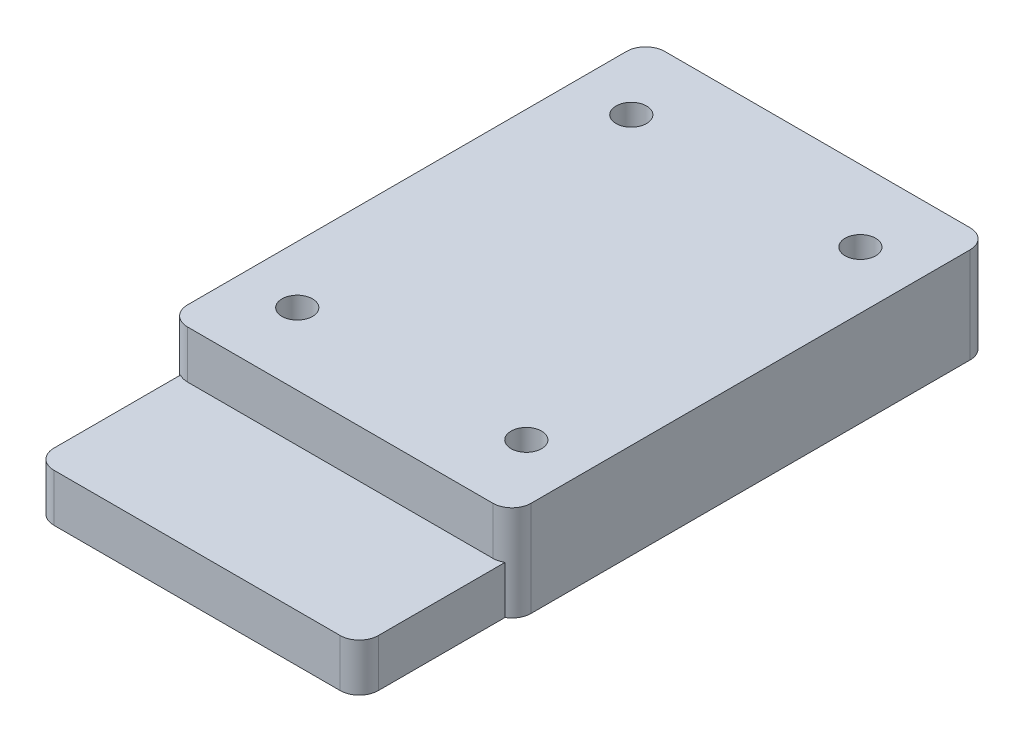
ISO-10303-21;
HEADER;
FILE_DESCRIPTION(('STEP AP214'),'2;1');
FILE_NAME('part.step','',(''),(''),'','','');
FILE_SCHEMA(('AUTOMOTIVE_DESIGN { 1 0 10303 214 1 1 1 1 }'));
ENDSEC;
DATA;
#1=APPLICATION_CONTEXT('core data for automotive mechanical design processes');
#2=APPLICATION_PROTOCOL_DEFINITION('international standard','automotive_design',2000,#1);
#3=PRODUCT_CONTEXT('',#1,'mechanical');
#4=PRODUCT('Part','Part','',(#3));
#5=PRODUCT_RELATED_PRODUCT_CATEGORY('part','',(#4));
#6=PRODUCT_DEFINITION_FORMATION('','',#4);
#7=PRODUCT_DEFINITION_CONTEXT('part definition',#1,'design');
#8=PRODUCT_DEFINITION('design','',#6,#7);
#9=PRODUCT_DEFINITION_SHAPE('','',#8);
#10=(LENGTH_UNIT() NAMED_UNIT(*) SI_UNIT(.MILLI.,.METRE.));
#11=(NAMED_UNIT(*) PLANE_ANGLE_UNIT() SI_UNIT($,.RADIAN.));
#12=(NAMED_UNIT(*) SI_UNIT($,.STERADIAN.) SOLID_ANGLE_UNIT());
#13=UNCERTAINTY_MEASURE_WITH_UNIT(LENGTH_MEASURE(1.E-05),#10,'distance_accuracy_value','');
#14=(GEOMETRIC_REPRESENTATION_CONTEXT(3) GLOBAL_UNCERTAINTY_ASSIGNED_CONTEXT((#13)) GLOBAL_UNIT_ASSIGNED_CONTEXT((#10,
#11,#12)) REPRESENTATION_CONTEXT('',''));
#15=CARTESIAN_POINT('',(0.,0.,0.));
#16=DIRECTION('',(0.,0.,1.));
#17=DIRECTION('',(1.,0.,0.));
#18=AXIS2_PLACEMENT_3D('',#15,#16,#17);
#19=CARTESIAN_POINT('',(-17.,10.,0.));
#20=DIRECTION('',(-1.,0.,0.));
#21=DIRECTION('',(0.,0.,1.));
#22=AXIS2_PLACEMENT_3D('',#19,#20,#21);
#23=PLANE('',#22);
#24=DIRECTION('',(0.,0.,-1.));
#25=VECTOR('',#24,1.);
#26=CARTESIAN_POINT('',(-17.,0.,0.));
#27=LINE('',#26,#25);
#28=CARTESIAN_POINT('',(-17.,0.,38.));
#29=VERTEX_POINT('',#28);
#30=CARTESIAN_POINT('',(-17.,0.,24.7320508075689));
#31=VERTEX_POINT('',#30);
#32=EDGE_CURVE('E284',#29,#31,#27,.T.);
#33=ORIENTED_EDGE('',*,*,#32,.F.);
#34=DIRECTION('',(0.,-1.,0.));
#35=VECTOR('',#34,1.);
#36=CARTESIAN_POINT('',(-17.,5.,38.));
#37=LINE('',#36,#35);
#38=CARTESIAN_POINT('',(-17.,5.,38.));
#39=VERTEX_POINT('',#38);
#40=EDGE_CURVE('E220',#29,#39,#37,.F.);
#41=ORIENTED_EDGE('',*,*,#40,.T.);
#42=DIRECTION('',(0.,0.,1.));
#43=VECTOR('',#42,1.);
#44=CARTESIAN_POINT('',(-17.,5.,25.));
#45=LINE('',#44,#43);
#46=CARTESIAN_POINT('',(-17.,5.,24.7320508075689));
#47=VERTEX_POINT('',#46);
#48=EDGE_CURVE('E63',#47,#39,#45,.T.);
#49=ORIENTED_EDGE('',*,*,#48,.F.);
#50=DIRECTION('',(0.,-1.,0.));
#51=VECTOR('',#50,1.);
#52=CARTESIAN_POINT('',(-17.,5.,24.7320508075689));
#53=LINE('',#52,#51);
#54=EDGE_CURVE('E224',#47,#31,#53,.T.);
#55=ORIENTED_EDGE('',*,*,#54,.T.);
#56=EDGE_LOOP('',(#33,#41,#49,#55));
#57=FACE_BOUND('',#56,.T.);
#58=ADVANCED_FACE('F41',(#57),#23,.T.);
#59=CARTESIAN_POINT('',(0.,10.,40.));
#60=DIRECTION('',(0.,0.,-1.));
#61=DIRECTION('',(-1.,0.,0.));
#62=AXIS2_PLACEMENT_3D('',#59,#60,#61);
#63=PLANE('',#62);
#64=DIRECTION('',(1.,0.,0.));
#65=VECTOR('',#64,1.);
#66=CARTESIAN_POINT('',(0.,0.,40.));
#67=LINE('',#66,#65);
#68=CARTESIAN_POINT('',(-15.,0.,40.));
#69=VERTEX_POINT('',#68);
#70=CARTESIAN_POINT('',(15.,0.,40.));
#71=VERTEX_POINT('',#70);
#72=EDGE_CURVE('E285',#69,#71,#67,.T.);
#73=ORIENTED_EDGE('',*,*,#72,.T.);
#74=DIRECTION('',(0.,-1.,0.));
#75=VECTOR('',#74,1.);
#76=CARTESIAN_POINT('',(15.,10.,40.));
#77=LINE('',#76,#75);
#78=CARTESIAN_POINT('',(15.,5.,40.));
#79=VERTEX_POINT('',#78);
#80=EDGE_CURVE('E214',#71,#79,#77,.F.);
#81=ORIENTED_EDGE('',*,*,#80,.T.);
#82=DIRECTION('',(1.,0.,0.));
#83=VECTOR('',#82,1.);
#84=CARTESIAN_POINT('',(-17.,5.,40.));
#85=LINE('',#84,#83);
#86=CARTESIAN_POINT('',(-15.,5.,40.));
#87=VERTEX_POINT('',#86);
#88=EDGE_CURVE('E245',#87,#79,#85,.T.);
#89=ORIENTED_EDGE('',*,*,#88,.F.);
#90=DIRECTION('',(0.,-1.,0.));
#91=VECTOR('',#90,1.);
#92=CARTESIAN_POINT('',(-15.,0.,40.));
#93=LINE('',#92,#91);
#94=EDGE_CURVE('E211',#87,#69,#93,.T.);
#95=ORIENTED_EDGE('',*,*,#94,.T.);
#96=EDGE_LOOP('',(#73,#81,#89,#95));
#97=FACE_BOUND('',#96,.T.);
#98=ADVANCED_FACE('F290',(#97),#63,.F.);
#99=CARTESIAN_POINT('',(17.,10.,0.));
#100=DIRECTION('',(-1.,0.,0.));
#101=DIRECTION('',(0.,0.,1.));
#102=AXIS2_PLACEMENT_3D('',#99,#100,#101);
#103=PLANE('',#102);
#104=DIRECTION('',(0.,0.,-1.));
#105=VECTOR('',#104,1.);
#106=CARTESIAN_POINT('',(17.,5.,25.));
#107=LINE('',#106,#105);
#108=CARTESIAN_POINT('',(17.,5.,38.));
#109=VERTEX_POINT('',#108);
#110=CARTESIAN_POINT('',(17.,5.,24.7320508075689));
#111=VERTEX_POINT('',#110);
#112=EDGE_CURVE('E55',#109,#111,#107,.T.);
#113=ORIENTED_EDGE('',*,*,#112,.F.);
#114=DIRECTION('',(0.,-1.,0.));
#115=VECTOR('',#114,1.);
#116=CARTESIAN_POINT('',(17.,10.,38.));
#117=LINE('',#116,#115);
#118=CARTESIAN_POINT('',(17.,0.,38.));
#119=VERTEX_POINT('',#118);
#120=EDGE_CURVE('E208',#109,#119,#117,.T.);
#121=ORIENTED_EDGE('',*,*,#120,.T.);
#122=DIRECTION('',(0.,0.,-1.));
#123=VECTOR('',#122,1.);
#124=CARTESIAN_POINT('',(17.,0.,0.));
#125=LINE('',#124,#123);
#126=CARTESIAN_POINT('',(17.,0.,24.7320508075689));
#127=VERTEX_POINT('',#126);
#128=EDGE_CURVE('E176',#119,#127,#125,.T.);
#129=ORIENTED_EDGE('',*,*,#128,.T.);
#130=DIRECTION('',(0.,1.,0.));
#131=VECTOR('',#130,1.);
#132=CARTESIAN_POINT('',(17.,0.,24.7320508075689));
#133=LINE('',#132,#131);
#134=EDGE_CURVE('E49',#127,#111,#133,.T.);
#135=ORIENTED_EDGE('',*,*,#134,.T.);
#136=EDGE_LOOP('',(#113,#121,#129,#135));
#137=FACE_BOUND('',#136,.T.);
#138=ADVANCED_FACE('F228',(#137),#103,.F.);
#139=CARTESIAN_POINT('',(18.,10.,0.));
#140=DIRECTION('',(1.,0.,0.));
#141=DIRECTION('',(0.,0.,-1.));
#142=AXIS2_PLACEMENT_3D('',#139,#140,#141);
#143=PLANE('',#142);
#144=DIRECTION('',(0.,0.,1.));
#145=VECTOR('',#144,1.);
#146=CARTESIAN_POINT('',(18.,0.,0.));
#147=LINE('',#146,#145);
#148=CARTESIAN_POINT('',(18.,0.,-23.));
#149=VERTEX_POINT('',#148);
#150=CARTESIAN_POINT('',(18.,0.,23.));
#151=VERTEX_POINT('',#150);
#152=EDGE_CURVE('E163',#149,#151,#147,.T.);
#153=ORIENTED_EDGE('',*,*,#152,.F.);
#154=DIRECTION('',(0.,-1.,0.));
#155=VECTOR('',#154,1.);
#156=CARTESIAN_POINT('',(18.,10.,-23.));
#157=LINE('',#156,#155);
#158=CARTESIAN_POINT('',(18.,10.,-23.));
#159=VERTEX_POINT('',#158);
#160=EDGE_CURVE('E190',#149,#159,#157,.F.);
#161=ORIENTED_EDGE('',*,*,#160,.T.);
#162=DIRECTION('',(0.,0.,1.));
#163=VECTOR('',#162,1.);
#164=CARTESIAN_POINT('',(18.,10.,0.));
#165=LINE('',#164,#163);
#166=CARTESIAN_POINT('',(18.,10.,23.));
#167=VERTEX_POINT('',#166);
#168=EDGE_CURVE('E274',#159,#167,#165,.T.);
#169=ORIENTED_EDGE('',*,*,#168,.T.);
#170=DIRECTION('',(0.,-1.,0.));
#171=VECTOR('',#170,1.);
#172=CARTESIAN_POINT('',(18.,0.,23.));
#173=LINE('',#172,#171);
#174=EDGE_CURVE('E187',#167,#151,#173,.T.);
#175=ORIENTED_EDGE('',*,*,#174,.T.);
#176=EDGE_LOOP('',(#153,#161,#169,#175));
#177=FACE_BOUND('',#176,.T.);
#178=ADVANCED_FACE('F319',(#177),#143,.T.);
#179=CARTESIAN_POINT('',(0.,10.,-25.));
#180=DIRECTION('',(0.,0.,-1.));
#181=DIRECTION('',(-1.,0.,0.));
#182=AXIS2_PLACEMENT_3D('',#179,#180,#181);
#183=PLANE('',#182);
#184=DIRECTION('',(1.,0.,0.));
#185=VECTOR('',#184,1.);
#186=CARTESIAN_POINT('',(0.,10.,-25.));
#187=LINE('',#186,#185);
#188=CARTESIAN_POINT('',(-16.,10.,-25.));
#189=VERTEX_POINT('',#188);
#190=CARTESIAN_POINT('',(16.,10.,-25.));
#191=VERTEX_POINT('',#190);
#192=EDGE_CURVE('E277',#189,#191,#187,.T.);
#193=ORIENTED_EDGE('',*,*,#192,.T.);
#194=DIRECTION('',(0.,-1.,0.));
#195=VECTOR('',#194,1.);
#196=CARTESIAN_POINT('',(16.,10.,-25.));
#197=LINE('',#196,#195);
#198=CARTESIAN_POINT('',(16.,0.,-25.));
#199=VERTEX_POINT('',#198);
#200=EDGE_CURVE('E162',#191,#199,#197,.T.);
#201=ORIENTED_EDGE('',*,*,#200,.T.);
#202=DIRECTION('',(1.,0.,0.));
#203=VECTOR('',#202,1.);
#204=CARTESIAN_POINT('',(0.,0.,-25.));
#205=LINE('',#204,#203);
#206=CARTESIAN_POINT('',(-16.,0.,-25.));
#207=VERTEX_POINT('',#206);
#208=EDGE_CURVE('E145',#207,#199,#205,.T.);
#209=ORIENTED_EDGE('',*,*,#208,.F.);
#210=DIRECTION('',(0.,-1.,0.));
#211=VECTOR('',#210,1.);
#212=CARTESIAN_POINT('',(-16.,10.,-25.));
#213=LINE('',#212,#211);
#214=EDGE_CURVE('E159',#207,#189,#213,.F.);
#215=ORIENTED_EDGE('',*,*,#214,.T.);
#216=EDGE_LOOP('',(#193,#201,#209,#215));
#217=FACE_BOUND('',#216,.T.);
#218=ADVANCED_FACE('F158',(#217),#183,.T.);
#219=CARTESIAN_POINT('',(-18.,10.,0.));
#220=DIRECTION('',(1.,0.,0.));
#221=DIRECTION('',(0.,0.,-1.));
#222=AXIS2_PLACEMENT_3D('',#219,#220,#221);
#223=PLANE('',#222);
#224=DIRECTION('',(0.,0.,1.));
#225=VECTOR('',#224,1.);
#226=CARTESIAN_POINT('',(-18.,10.,0.));
#227=LINE('',#226,#225);
#228=CARTESIAN_POINT('',(-18.,10.,-23.));
#229=VERTEX_POINT('',#228);
#230=CARTESIAN_POINT('',(-18.,10.,23.));
#231=VERTEX_POINT('',#230);
#232=EDGE_CURVE('E173',#229,#231,#227,.T.);
#233=ORIENTED_EDGE('',*,*,#232,.F.);
#234=DIRECTION('',(0.,-1.,0.));
#235=VECTOR('',#234,1.);
#236=CARTESIAN_POINT('',(-18.,0.,-23.));
#237=LINE('',#236,#235);
#238=CARTESIAN_POINT('',(-18.,0.,-23.));
#239=VERTEX_POINT('',#238);
#240=EDGE_CURVE('E201',#229,#239,#237,.T.);
#241=ORIENTED_EDGE('',*,*,#240,.T.);
#242=DIRECTION('',(0.,0.,1.));
#243=VECTOR('',#242,1.);
#244=CARTESIAN_POINT('',(-18.,0.,0.));
#245=LINE('',#244,#243);
#246=CARTESIAN_POINT('',(-18.,0.,23.));
#247=VERTEX_POINT('',#246);
#248=EDGE_CURVE('E147',#239,#247,#245,.T.);
#249=ORIENTED_EDGE('',*,*,#248,.T.);
#250=DIRECTION('',(0.,-1.,0.));
#251=VECTOR('',#250,1.);
#252=CARTESIAN_POINT('',(-18.,10.,23.));
#253=LINE('',#252,#251);
#254=EDGE_CURVE('E199',#247,#231,#253,.F.);
#255=ORIENTED_EDGE('',*,*,#254,.T.);
#256=EDGE_LOOP('',(#233,#241,#249,#255));
#257=FACE_BOUND('',#256,.T.);
#258=ADVANCED_FACE('F308',(#257),#223,.F.);
#259=CARTESIAN_POINT('',(0.,10.,25.));
#260=DIRECTION('',(0.,0.,-1.));
#261=DIRECTION('',(-1.,0.,0.));
#262=AXIS2_PLACEMENT_3D('',#259,#260,#261);
#263=PLANE('',#262);
#264=DIRECTION('',(1.,0.,0.));
#265=VECTOR('',#264,1.);
#266=CARTESIAN_POINT('',(0.,10.,25.));
#267=LINE('',#266,#265);
#268=CARTESIAN_POINT('',(-16.,10.,25.));
#269=VERTEX_POINT('',#268);
#270=CARTESIAN_POINT('',(16.,10.,25.));
#271=VERTEX_POINT('',#270);
#272=EDGE_CURVE('E168',#269,#271,#267,.T.);
#273=ORIENTED_EDGE('',*,*,#272,.F.);
#274=DIRECTION('',(0.,-1.,0.));
#275=VECTOR('',#274,1.);
#276=CARTESIAN_POINT('',(-16.,10.,25.));
#277=LINE('',#276,#275);
#278=CARTESIAN_POINT('',(-16.,5.,25.));
#279=VERTEX_POINT('',#278);
#280=EDGE_CURVE('E205',#269,#279,#277,.T.);
#281=ORIENTED_EDGE('',*,*,#280,.T.);
#282=DIRECTION('',(-1.,0.,0.));
#283=VECTOR('',#282,1.);
#284=CARTESIAN_POINT('',(-17.,5.,25.));
#285=LINE('',#284,#283);
#286=CARTESIAN_POINT('',(16.,5.,25.));
#287=VERTEX_POINT('',#286);
#288=EDGE_CURVE('E239',#287,#279,#285,.T.);
#289=ORIENTED_EDGE('',*,*,#288,.F.);
#290=DIRECTION('',(0.,-1.,0.));
#291=VECTOR('',#290,1.);
#292=CARTESIAN_POINT('',(16.,10.,25.));
#293=LINE('',#292,#291);
#294=EDGE_CURVE('E203',#287,#271,#293,.F.);
#295=ORIENTED_EDGE('',*,*,#294,.T.);
#296=EDGE_LOOP('',(#273,#281,#289,#295));
#297=FACE_BOUND('',#296,.T.);
#298=ADVANCED_FACE('F242',(#297),#263,.F.);
#299=CARTESIAN_POINT('',(0.,10.,0.));
#300=DIRECTION('',(0.,1.,0.));
#301=DIRECTION('',(0.,0.,1.));
#302=AXIS2_PLACEMENT_3D('',#299,#300,#301);
#303=PLANE('',#302);
#304=ORIENTED_EDGE('',*,*,#168,.F.);
#305=CARTESIAN_POINT('',(16.,10.,-23.));
#306=DIRECTION('',(0.,1.,0.));
#307=DIRECTION('',(0.,0.,1.));
#308=AXIS2_PLACEMENT_3D('',#305,#306,#307);
#309=CIRCLE('',#308,2.);
#310=EDGE_CURVE('E197',#159,#191,#309,.T.);
#311=ORIENTED_EDGE('',*,*,#310,.T.);
#312=ORIENTED_EDGE('',*,*,#192,.F.);
#313=CARTESIAN_POINT('',(-16.,10.,-23.));
#314=DIRECTION('',(0.,1.,0.));
#315=DIRECTION('',(0.,0.,1.));
#316=AXIS2_PLACEMENT_3D('',#313,#314,#315);
#317=CIRCLE('',#316,2.);
#318=EDGE_CURVE('E167',#189,#229,#317,.T.);
#319=ORIENTED_EDGE('',*,*,#318,.T.);
#320=ORIENTED_EDGE('',*,*,#232,.T.);
#321=CARTESIAN_POINT('',(-16.,10.,23.));
#322=DIRECTION('',(0.,1.,0.));
#323=DIRECTION('',(0.,0.,1.));
#324=AXIS2_PLACEMENT_3D('',#321,#322,#323);
#325=CIRCLE('',#324,2.);
#326=EDGE_CURVE('E194',#231,#269,#325,.T.);
#327=ORIENTED_EDGE('',*,*,#326,.T.);
#328=ORIENTED_EDGE('',*,*,#272,.T.);
#329=CARTESIAN_POINT('',(16.,10.,23.));
#330=DIRECTION('',(0.,1.,0.));
#331=DIRECTION('',(0.,0.,1.));
#332=AXIS2_PLACEMENT_3D('',#329,#330,#331);
#333=CIRCLE('',#332,2.);
#334=EDGE_CURVE('E192',#271,#167,#333,.T.);
#335=ORIENTED_EDGE('',*,*,#334,.T.);
#336=EDGE_LOOP('',(#304,#311,#312,#319,#320,#327,#328,#335));
#337=FACE_BOUND('',#336,.T.);
#338=CARTESIAN_POINT('',(12.,10.,17.5));
#339=DIRECTION('',(0.,1.,0.));
#340=DIRECTION('',(0.,0.,1.));
#341=AXIS2_PLACEMENT_3D('',#338,#339,#340);
#342=CIRCLE('',#341,1.6);
#343=CARTESIAN_POINT('',(12.,10.,19.1));
#344=VERTEX_POINT('',#343);
#345=EDGE_CURVE('E250',#344,#344,#342,.T.);
#346=ORIENTED_EDGE('',*,*,#345,.F.);
#347=EDGE_LOOP('',(#346));
#348=FACE_BOUND('',#347,.T.);
#349=CARTESIAN_POINT('',(-12.,10.,17.5));
#350=DIRECTION('',(0.,1.,0.));
#351=DIRECTION('',(0.,0.,1.));
#352=AXIS2_PLACEMENT_3D('',#349,#350,#351);
#353=CIRCLE('',#352,1.6);
#354=CARTESIAN_POINT('',(-12.,10.,19.1));
#355=VERTEX_POINT('',#354);
#356=EDGE_CURVE('E261',#355,#355,#353,.T.);
#357=ORIENTED_EDGE('',*,*,#356,.F.);
#358=EDGE_LOOP('',(#357));
#359=FACE_BOUND('',#358,.T.);
#360=CARTESIAN_POINT('',(-12.,10.,-17.5));
#361=DIRECTION('',(0.,1.,0.));
#362=DIRECTION('',(0.,0.,1.));
#363=AXIS2_PLACEMENT_3D('',#360,#361,#362);
#364=CIRCLE('',#363,1.6);
#365=CARTESIAN_POINT('',(-12.,10.,-15.9));
#366=VERTEX_POINT('',#365);
#367=EDGE_CURVE('E255',#366,#366,#364,.T.);
#368=ORIENTED_EDGE('',*,*,#367,.F.);
#369=EDGE_LOOP('',(#368));
#370=FACE_BOUND('',#369,.T.);
#371=CARTESIAN_POINT('',(12.,10.,-17.5));
#372=DIRECTION('',(0.,1.,0.));
#373=DIRECTION('',(0.,0.,1.));
#374=AXIS2_PLACEMENT_3D('',#371,#372,#373);
#375=CIRCLE('',#374,1.6);
#376=CARTESIAN_POINT('',(12.,10.,-15.9));
#377=VERTEX_POINT('',#376);
#378=EDGE_CURVE('E254',#377,#377,#375,.T.);
#379=ORIENTED_EDGE('',*,*,#378,.F.);
#380=EDGE_LOOP('',(#379));
#381=FACE_BOUND('',#380,.T.);
#382=ADVANCED_FACE('F311',(#337,#348,#359,#370,#381),#303,.T.);
#383=CARTESIAN_POINT('',(0.,0.,0.));
#384=DIRECTION('',(0.,1.,0.));
#385=DIRECTION('',(0.,0.,1.));
#386=AXIS2_PLACEMENT_3D('',#383,#384,#385);
#387=PLANE('',#386);
#388=CARTESIAN_POINT('',(12.,0.,17.5));
#389=DIRECTION('',(0.,1.,0.));
#390=DIRECTION('',(0.,0.,1.));
#391=AXIS2_PLACEMENT_3D('',#388,#389,#390);
#392=CIRCLE('',#391,1.6);
#393=CARTESIAN_POINT('',(12.,0.,19.1));
#394=VERTEX_POINT('',#393);
#395=EDGE_CURVE('E264',#394,#394,#392,.T.);
#396=ORIENTED_EDGE('',*,*,#395,.T.);
#397=EDGE_LOOP('',(#396));
#398=FACE_BOUND('',#397,.T.);
#399=CARTESIAN_POINT('',(-12.,0.,17.5));
#400=DIRECTION('',(0.,1.,0.));
#401=DIRECTION('',(0.,0.,1.));
#402=AXIS2_PLACEMENT_3D('',#399,#400,#401);
#403=CIRCLE('',#402,1.6);
#404=CARTESIAN_POINT('',(-12.,0.,19.1));
#405=VERTEX_POINT('',#404);
#406=EDGE_CURVE('E258',#405,#405,#403,.T.);
#407=ORIENTED_EDGE('',*,*,#406,.T.);
#408=EDGE_LOOP('',(#407));
#409=FACE_BOUND('',#408,.T.);
#410=CARTESIAN_POINT('',(-12.,0.,-17.5));
#411=DIRECTION('',(0.,1.,0.));
#412=DIRECTION('',(0.,0.,1.));
#413=AXIS2_PLACEMENT_3D('',#410,#411,#412);
#414=CIRCLE('',#413,1.6);
#415=CARTESIAN_POINT('',(-12.,0.,-15.9));
#416=VERTEX_POINT('',#415);
#417=EDGE_CURVE('E251',#416,#416,#414,.T.);
#418=ORIENTED_EDGE('',*,*,#417,.T.);
#419=EDGE_LOOP('',(#418));
#420=FACE_BOUND('',#419,.T.);
#421=CARTESIAN_POINT('',(12.,0.,-17.5));
#422=DIRECTION('',(0.,1.,0.));
#423=DIRECTION('',(0.,0.,1.));
#424=AXIS2_PLACEMENT_3D('',#421,#422,#423);
#425=CIRCLE('',#424,1.6);
#426=CARTESIAN_POINT('',(12.,0.,-15.9));
#427=VERTEX_POINT('',#426);
#428=EDGE_CURVE('E269',#427,#427,#425,.T.);
#429=ORIENTED_EDGE('',*,*,#428,.T.);
#430=EDGE_LOOP('',(#429));
#431=FACE_BOUND('',#430,.T.);
#432=ORIENTED_EDGE('',*,*,#208,.T.);
#433=CARTESIAN_POINT('',(16.,0.,-23.));
#434=DIRECTION('',(0.,1.,0.));
#435=DIRECTION('',(0.,0.,1.));
#436=AXIS2_PLACEMENT_3D('',#433,#434,#435);
#437=CIRCLE('',#436,2.);
#438=EDGE_CURVE('E152',#199,#149,#437,.F.);
#439=ORIENTED_EDGE('',*,*,#438,.T.);
#440=ORIENTED_EDGE('',*,*,#152,.T.);
#441=CARTESIAN_POINT('',(16.,0.,23.));
#442=DIRECTION('',(0.,1.,0.));
#443=DIRECTION('',(0.,0.,1.));
#444=AXIS2_PLACEMENT_3D('',#441,#442,#443);
#445=CIRCLE('',#444,2.);
#446=EDGE_CURVE('E180',#151,#127,#445,.F.);
#447=ORIENTED_EDGE('',*,*,#446,.T.);
#448=ORIENTED_EDGE('',*,*,#128,.F.);
#449=CARTESIAN_POINT('',(15.,0.,38.));
#450=DIRECTION('',(0.,1.,0.));
#451=DIRECTION('',(0.,0.,1.));
#452=AXIS2_PLACEMENT_3D('',#449,#450,#451);
#453=CIRCLE('',#452,2.);
#454=EDGE_CURVE('E183',#119,#71,#453,.F.);
#455=ORIENTED_EDGE('',*,*,#454,.T.);
#456=ORIENTED_EDGE('',*,*,#72,.F.);
#457=CARTESIAN_POINT('',(-15.,0.,38.));
#458=DIRECTION('',(0.,1.,0.));
#459=DIRECTION('',(0.,0.,1.));
#460=AXIS2_PLACEMENT_3D('',#457,#458,#459);
#461=CIRCLE('',#460,2.);
#462=EDGE_CURVE('E170',#69,#29,#461,.F.);
#463=ORIENTED_EDGE('',*,*,#462,.T.);
#464=ORIENTED_EDGE('',*,*,#32,.T.);
#465=CARTESIAN_POINT('',(-16.,0.,23.));
#466=DIRECTION('',(0.,1.,0.));
#467=DIRECTION('',(0.,0.,1.));
#468=AXIS2_PLACEMENT_3D('',#465,#466,#467);
#469=CIRCLE('',#468,2.);
#470=EDGE_CURVE('E153',#31,#247,#469,.F.);
#471=ORIENTED_EDGE('',*,*,#470,.T.);
#472=ORIENTED_EDGE('',*,*,#248,.F.);
#473=CARTESIAN_POINT('',(-16.,0.,-23.));
#474=DIRECTION('',(0.,1.,0.));
#475=DIRECTION('',(0.,0.,1.));
#476=AXIS2_PLACEMENT_3D('',#473,#474,#475);
#477=CIRCLE('',#476,2.);
#478=EDGE_CURVE('E142',#239,#207,#477,.F.);
#479=ORIENTED_EDGE('',*,*,#478,.T.);
#480=EDGE_LOOP('',(#432,#439,#440,#447,#448,#455,#456,#463,#464,#471,#472,#479));
#481=FACE_BOUND('',#480,.T.);
#482=ADVANCED_FACE('F144',(#398,#409,#420,#431,#481),#387,.F.);
#483=CARTESIAN_POINT('',(12.,0.,-17.5));
#484=DIRECTION('',(0.,1.,0.));
#485=DIRECTION('',(0.,0.,1.));
#486=AXIS2_PLACEMENT_3D('',#483,#484,#485);
#487=CYLINDRICAL_SURFACE('',#486,1.6);
#488=ORIENTED_EDGE('',*,*,#428,.F.);
#489=EDGE_LOOP('',(#488));
#490=FACE_BOUND('',#489,.T.);
#491=ORIENTED_EDGE('',*,*,#378,.T.);
#492=EDGE_LOOP('',(#491));
#493=FACE_BOUND('',#492,.T.);
#494=ADVANCED_FACE('F349',(#490,#493),#487,.F.);
#495=CARTESIAN_POINT('',(-12.,0.,-17.5));
#496=DIRECTION('',(0.,1.,0.));
#497=DIRECTION('',(0.,0.,1.));
#498=AXIS2_PLACEMENT_3D('',#495,#496,#497);
#499=CYLINDRICAL_SURFACE('',#498,1.6);
#500=ORIENTED_EDGE('',*,*,#417,.F.);
#501=EDGE_LOOP('',(#500));
#502=FACE_BOUND('',#501,.T.);
#503=ORIENTED_EDGE('',*,*,#367,.T.);
#504=EDGE_LOOP('',(#503));
#505=FACE_BOUND('',#504,.T.);
#506=ADVANCED_FACE('F354',(#502,#505),#499,.F.);
#507=CARTESIAN_POINT('',(-12.,0.,17.5));
#508=DIRECTION('',(0.,1.,0.));
#509=DIRECTION('',(0.,0.,1.));
#510=AXIS2_PLACEMENT_3D('',#507,#508,#509);
#511=CYLINDRICAL_SURFACE('',#510,1.6);
#512=ORIENTED_EDGE('',*,*,#406,.F.);
#513=EDGE_LOOP('',(#512));
#514=FACE_BOUND('',#513,.T.);
#515=ORIENTED_EDGE('',*,*,#356,.T.);
#516=EDGE_LOOP('',(#515));
#517=FACE_BOUND('',#516,.T.);
#518=ADVANCED_FACE('F358',(#514,#517),#511,.F.);
#519=CARTESIAN_POINT('',(12.,0.,17.5));
#520=DIRECTION('',(0.,1.,0.));
#521=DIRECTION('',(0.,0.,1.));
#522=AXIS2_PLACEMENT_3D('',#519,#520,#521);
#523=CYLINDRICAL_SURFACE('',#522,1.6);
#524=ORIENTED_EDGE('',*,*,#395,.F.);
#525=EDGE_LOOP('',(#524));
#526=FACE_BOUND('',#525,.T.);
#527=ORIENTED_EDGE('',*,*,#345,.T.);
#528=EDGE_LOOP('',(#527));
#529=FACE_BOUND('',#528,.T.);
#530=ADVANCED_FACE('F356',(#526,#529),#523,.F.);
#531=CARTESIAN_POINT('',(0.,5.,0.));
#532=DIRECTION('',(0.,1.,0.));
#533=DIRECTION('',(0.,0.,1.));
#534=AXIS2_PLACEMENT_3D('',#531,#532,#533);
#535=PLANE('',#534);
#536=ORIENTED_EDGE('',*,*,#88,.T.);
#537=CARTESIAN_POINT('',(15.,5.,38.));
#538=DIRECTION('',(0.,1.,0.));
#539=DIRECTION('',(0.,0.,1.));
#540=AXIS2_PLACEMENT_3D('',#537,#538,#539);
#541=CIRCLE('',#540,2.);
#542=EDGE_CURVE('E218',#79,#109,#541,.T.);
#543=ORIENTED_EDGE('',*,*,#542,.T.);
#544=ORIENTED_EDGE('',*,*,#112,.T.);
#545=CARTESIAN_POINT('',(16.,5.,23.));
#546=DIRECTION('',(0.,1.,0.));
#547=DIRECTION('',(0.,0.,1.));
#548=AXIS2_PLACEMENT_3D('',#545,#546,#547);
#549=CIRCLE('',#548,2.);
#550=EDGE_CURVE('E11',#111,#287,#549,.F.);
#551=ORIENTED_EDGE('',*,*,#550,.T.);
#552=ORIENTED_EDGE('',*,*,#288,.T.);
#553=CARTESIAN_POINT('',(-16.,5.,23.));
#554=DIRECTION('',(0.,1.,0.));
#555=DIRECTION('',(0.,0.,1.));
#556=AXIS2_PLACEMENT_3D('',#553,#554,#555);
#557=CIRCLE('',#556,2.);
#558=EDGE_CURVE('E222',#279,#47,#557,.F.);
#559=ORIENTED_EDGE('',*,*,#558,.T.);
#560=ORIENTED_EDGE('',*,*,#48,.T.);
#561=CARTESIAN_POINT('',(-15.,5.,38.));
#562=DIRECTION('',(0.,1.,0.));
#563=DIRECTION('',(0.,0.,1.));
#564=AXIS2_PLACEMENT_3D('',#561,#562,#563);
#565=CIRCLE('',#564,2.);
#566=EDGE_CURVE('E216',#39,#87,#565,.T.);
#567=ORIENTED_EDGE('',*,*,#566,.T.);
#568=EDGE_LOOP('',(#536,#543,#544,#551,#552,#559,#560,#567));
#569=FACE_BOUND('',#568,.T.);
#570=ADVANCED_FACE('F238',(#569),#535,.T.);
#571=CARTESIAN_POINT('',(16.,10.,-23.));
#572=DIRECTION('',(0.,-1.,0.));
#573=DIRECTION('',(0.,0.,-1.));
#574=AXIS2_PLACEMENT_3D('',#571,#572,#573);
#575=CYLINDRICAL_SURFACE('',#574,2.);
#576=ORIENTED_EDGE('',*,*,#310,.F.);
#577=ORIENTED_EDGE('',*,*,#160,.F.);
#578=ORIENTED_EDGE('',*,*,#438,.F.);
#579=ORIENTED_EDGE('',*,*,#200,.F.);
#580=EDGE_LOOP('',(#576,#577,#578,#579));
#581=FACE_BOUND('',#580,.T.);
#582=ADVANCED_FACE('F315',(#581),#575,.T.);
#583=CARTESIAN_POINT('',(-16.,10.,-23.));
#584=DIRECTION('',(0.,1.,0.));
#585=DIRECTION('',(0.,0.,1.));
#586=AXIS2_PLACEMENT_3D('',#583,#584,#585);
#587=CYLINDRICAL_SURFACE('',#586,2.);
#588=ORIENTED_EDGE('',*,*,#318,.F.);
#589=ORIENTED_EDGE('',*,*,#214,.F.);
#590=ORIENTED_EDGE('',*,*,#478,.F.);
#591=ORIENTED_EDGE('',*,*,#240,.F.);
#592=EDGE_LOOP('',(#588,#589,#590,#591));
#593=FACE_BOUND('',#592,.T.);
#594=ADVANCED_FACE('F166',(#593),#587,.T.);
#595=CARTESIAN_POINT('',(-16.,10.,23.));
#596=DIRECTION('',(0.,-1.,0.));
#597=DIRECTION('',(0.,0.,-1.));
#598=AXIS2_PLACEMENT_3D('',#595,#596,#597);
#599=CYLINDRICAL_SURFACE('',#598,2.);
#600=ORIENTED_EDGE('',*,*,#326,.F.);
#601=ORIENTED_EDGE('',*,*,#254,.F.);
#602=ORIENTED_EDGE('',*,*,#470,.F.);
#603=ORIENTED_EDGE('',*,*,#54,.F.);
#604=ORIENTED_EDGE('',*,*,#558,.F.);
#605=ORIENTED_EDGE('',*,*,#280,.F.);
#606=EDGE_LOOP('',(#600,#601,#602,#603,#604,#605));
#607=FACE_BOUND('',#606,.T.);
#608=ADVANCED_FACE('F305',(#607),#599,.T.);
#609=CARTESIAN_POINT('',(15.,10.,38.));
#610=DIRECTION('',(0.,-1.,0.));
#611=DIRECTION('',(0.,0.,-1.));
#612=AXIS2_PLACEMENT_3D('',#609,#610,#611);
#613=CYLINDRICAL_SURFACE('',#612,2.);
#614=ORIENTED_EDGE('',*,*,#542,.F.);
#615=ORIENTED_EDGE('',*,*,#80,.F.);
#616=ORIENTED_EDGE('',*,*,#454,.F.);
#617=ORIENTED_EDGE('',*,*,#120,.F.);
#618=EDGE_LOOP('',(#614,#615,#616,#617));
#619=FACE_BOUND('',#618,.T.);
#620=ADVANCED_FACE('F295',(#619),#613,.T.);
#621=CARTESIAN_POINT('',(16.,10.,23.));
#622=DIRECTION('',(0.,1.,0.));
#623=DIRECTION('',(0.,0.,1.));
#624=AXIS2_PLACEMENT_3D('',#621,#622,#623);
#625=CYLINDRICAL_SURFACE('',#624,2.);
#626=ORIENTED_EDGE('',*,*,#334,.F.);
#627=ORIENTED_EDGE('',*,*,#294,.F.);
#628=ORIENTED_EDGE('',*,*,#550,.F.);
#629=ORIENTED_EDGE('',*,*,#134,.F.);
#630=ORIENTED_EDGE('',*,*,#446,.F.);
#631=ORIENTED_EDGE('',*,*,#174,.F.);
#632=EDGE_LOOP('',(#626,#627,#628,#629,#630,#631));
#633=FACE_BOUND('',#632,.T.);
#634=ADVANCED_FACE('F234',(#633),#625,.T.);
#635=CARTESIAN_POINT('',(-15.,10.,38.));
#636=DIRECTION('',(0.,1.,0.));
#637=DIRECTION('',(0.,0.,1.));
#638=AXIS2_PLACEMENT_3D('',#635,#636,#637);
#639=CYLINDRICAL_SURFACE('',#638,2.);
#640=ORIENTED_EDGE('',*,*,#566,.F.);
#641=ORIENTED_EDGE('',*,*,#40,.F.);
#642=ORIENTED_EDGE('',*,*,#462,.F.);
#643=ORIENTED_EDGE('',*,*,#94,.F.);
#644=EDGE_LOOP('',(#640,#641,#642,#643));
#645=FACE_BOUND('',#644,.T.);
#646=ADVANCED_FACE('F43',(#645),#639,.T.);
#647=CLOSED_SHELL('',(#58,#98,#138,#178,#218,#258,#298,#382,#482,#494,#506,#518,#530,#570,#582,
#594,#608,#620,#634,#646));
#648=MANIFOLD_SOLID_BREP('B2',#647);
#649=ADVANCED_BREP_SHAPE_REPRESENTATION('',(#18,#648),#14);
#650=SHAPE_DEFINITION_REPRESENTATION(#9,#649);
ENDSEC;
END-ISO-10303-21;
